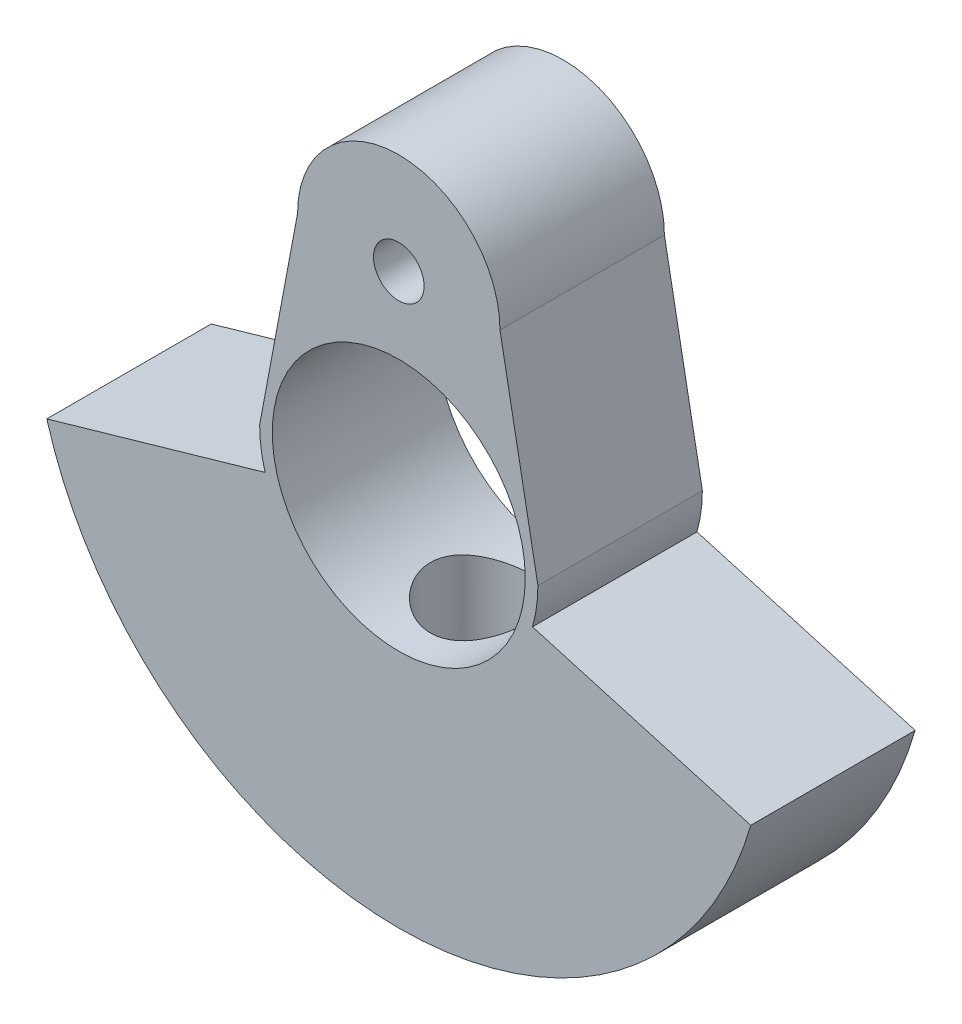
ISO-10303-21;
HEADER;
FILE_DESCRIPTION(('STEP AP214'),'2;1');
FILE_NAME('part.step','',(''),(''),'','','');
FILE_SCHEMA(('AUTOMOTIVE_DESIGN { 1 0 10303 214 1 1 1 1 }'));
ENDSEC;
DATA;
#1=APPLICATION_CONTEXT('core data for automotive mechanical design processes');
#2=APPLICATION_PROTOCOL_DEFINITION('international standard','automotive_design',2000,#1);
#3=PRODUCT_CONTEXT('',#1,'mechanical');
#4=PRODUCT('Part','Part','',(#3));
#5=PRODUCT_RELATED_PRODUCT_CATEGORY('part','',(#4));
#6=PRODUCT_DEFINITION_FORMATION('','',#4);
#7=PRODUCT_DEFINITION_CONTEXT('part definition',#1,'design');
#8=PRODUCT_DEFINITION('design','',#6,#7);
#9=PRODUCT_DEFINITION_SHAPE('','',#8);
#10=(LENGTH_UNIT() NAMED_UNIT(*) SI_UNIT(.MILLI.,.METRE.));
#11=(NAMED_UNIT(*) PLANE_ANGLE_UNIT() SI_UNIT($,.RADIAN.));
#12=(NAMED_UNIT(*) SI_UNIT($,.STERADIAN.) SOLID_ANGLE_UNIT());
#13=UNCERTAINTY_MEASURE_WITH_UNIT(LENGTH_MEASURE(1.E-05),#10,'distance_accuracy_value','');
#14=(GEOMETRIC_REPRESENTATION_CONTEXT(3) GLOBAL_UNCERTAINTY_ASSIGNED_CONTEXT((#13)) GLOBAL_UNIT_ASSIGNED_CONTEXT((#10,
#11,#12)) REPRESENTATION_CONTEXT('',''));
#15=CARTESIAN_POINT('',(0.,0.,0.));
#16=DIRECTION('',(0.,0.,1.));
#17=DIRECTION('',(1.,0.,0.));
#18=AXIS2_PLACEMENT_3D('',#15,#16,#17);
#19=CARTESIAN_POINT('',(0.,0.,6.5));
#20=DIRECTION('',(0.276307273264689,-0.961069347519227,0.));
#21=DIRECTION('',(0.961069347519227,0.276307273264689,0.));
#22=AXIS2_PLACEMENT_3D('',#19,#20,#21);
#23=PLANE('',#22);
#24=DIRECTION('',(-0.961069347519227,-0.276307273264689,0.));
#25=VECTOR('',#24,1.);
#26=CARTESIAN_POINT('',(0.,0.,0.));
#27=LINE('',#26,#25);
#28=CARTESIAN_POINT('',(-5.28588141135575,-1.51969000295579,0.));
#29=VERTEX_POINT('',#28);
#30=CARTESIAN_POINT('',(-13.9130517436444,-4.,0.));
#31=VERTEX_POINT('',#30);
#32=EDGE_CURVE('E271',#29,#31,#27,.T.);
#33=ORIENTED_EDGE('',*,*,#32,.T.);
#34=DIRECTION('',(0.,0.,-1.));
#35=VECTOR('',#34,1.);
#36=CARTESIAN_POINT('',(-13.9130517436444,-4.,6.5));
#37=LINE('',#36,#35);
#38=CARTESIAN_POINT('',(-13.9130517436444,-4.,6.5));
#39=VERTEX_POINT('',#38);
#40=EDGE_CURVE('E288',#39,#31,#37,.T.);
#41=ORIENTED_EDGE('',*,*,#40,.F.);
#42=DIRECTION('',(-0.961069347519227,-0.276307273264689,0.));
#43=VECTOR('',#42,1.);
#44=CARTESIAN_POINT('',(0.,0.,6.5));
#45=LINE('',#44,#43);
#46=CARTESIAN_POINT('',(-5.28588141135575,-1.51969000295579,6.5));
#47=VERTEX_POINT('',#46);
#48=EDGE_CURVE('E297',#47,#39,#45,.T.);
#49=ORIENTED_EDGE('',*,*,#48,.F.);
#50=DIRECTION('',(0.,0.,-1.));
#51=VECTOR('',#50,1.);
#52=CARTESIAN_POINT('',(-5.28588141135575,-1.51969000295579,6.5));
#53=LINE('',#52,#51);
#54=EDGE_CURVE('E176',#47,#29,#53,.T.);
#55=ORIENTED_EDGE('',*,*,#54,.T.);
#56=EDGE_LOOP('',(#33,#41,#49,#55));
#57=FACE_BOUND('',#56,.T.);
#58=ADVANCED_FACE('F162',(#57),#23,.F.);
#59=CARTESIAN_POINT('',(0.,0.,6.5));
#60=DIRECTION('',(0.,0.,-1.));
#61=DIRECTION('',(-1.,0.,0.));
#62=AXIS2_PLACEMENT_3D('',#59,#60,#61);
#63=CYLINDRICAL_SURFACE('',#62,14.4766366543243);
#64=CARTESIAN_POINT('',(0.,-14.4766366543243,5.25));
#65=CARTESIAN_POINT('',(0.11176995730836,-14.4766349668201,5.24999531787187));
#66=CARTESIAN_POINT('',(0.223607249879539,-14.4753286207826,5.24059899533927));
#67=CARTESIAN_POINT('',(0.444162743564742,-14.4702430368634,5.20326754317927));
#68=CARTESIAN_POINT('',(0.552877683008009,-14.4664613046852,5.17531371387353));
#69=CARTESIAN_POINT('',(0.763964109311459,-14.4568504521129,5.10171259079571));
#70=CARTESIAN_POINT('',(0.866340071077471,-14.451022795848,5.05607794756922));
#71=CARTESIAN_POINT('',(1.06196340075863,-14.4379661273012,4.94843995364321));
#72=CARTESIAN_POINT('',(1.15521218053627,-14.4307373322755,4.8864391400912));
#73=CARTESIAN_POINT('',(1.33057367524674,-14.4156299327617,4.74738745243392));
#74=CARTESIAN_POINT('',(1.41261670187738,-14.4077477119569,4.67024907648198));
#75=CARTESIAN_POINT('',(1.56263704508395,-14.3922505595565,4.50330008919239));
#76=CARTESIAN_POINT('',(1.63061359982885,-14.3846356424563,4.41348879194033));
#77=CARTESIAN_POINT('',(1.75083710498361,-14.3705000135134,4.22328244943422));
#78=CARTESIAN_POINT('',(1.80301765195349,-14.3639839705637,4.12284505566044));
#79=CARTESIAN_POINT('',(1.88974372511436,-14.3528325088659,3.91452718689346));
#80=CARTESIAN_POINT('',(1.92429006623307,-14.3481970032147,3.8066470561123));
#81=CARTESIAN_POINT('',(1.97455286721373,-14.3413665871692,3.58723453479968));
#82=CARTESIAN_POINT('',(1.99038788123958,-14.3391563170339,3.47572978922923));
#83=CARTESIAN_POINT('',(2.00314559266907,-14.3373798354986,3.25162542378678));
#84=CARTESIAN_POINT('',(2.00006921393182,-14.3378134949374,3.13902585766725));
#85=CARTESIAN_POINT('',(1.97518856404868,-14.3412618207326,2.91676000553503));
#86=CARTESIAN_POINT('',(1.95351561006842,-14.3442583889815,2.80707869879688));
#87=CARTESIAN_POINT('',(1.89226225338223,-14.3524666494243,2.59292465346332));
#88=CARTESIAN_POINT('',(1.85268141494161,-14.3576783955177,2.48845204167455));
#89=CARTESIAN_POINT('',(1.75659700882936,-14.3697500395445,2.28727727106512));
#90=CARTESIAN_POINT('',(1.70003710521645,-14.3766154089165,2.19060236096327));
#91=CARTESIAN_POINT('',(1.57164030454687,-14.3912166647664,2.00806608391306));
#92=CARTESIAN_POINT('',(1.49980255519563,-14.3989525997986,1.92220532067164));
#93=CARTESIAN_POINT('',(1.34216500524915,-14.4145035598929,1.76297296868527));
#94=CARTESIAN_POINT('',(1.25625215823762,-14.4223187001026,1.6897132590304));
#95=CARTESIAN_POINT('',(1.07329040129023,-14.4370864696785,1.55863616574628));
#96=CARTESIAN_POINT('',(0.976241455017491,-14.4440390962302,1.50081883250729));
#97=CARTESIAN_POINT('',(0.773670696365924,-14.4563042017067,1.40226478478454));
#98=CARTESIAN_POINT('',(0.668145029027119,-14.4616159290177,1.36153589461243));
#99=CARTESIAN_POINT('',(0.451662373390534,-14.4699942347764,1.29840793630832));
#100=CARTESIAN_POINT('',(0.340705696508999,-14.4730609417941,1.2760078184991));
#101=CARTESIAN_POINT('',(0.117477138548468,-14.4765868044994,1.25032016139866));
#102=CARTESIAN_POINT('',(0.00522329352126562,-14.4770669647086,1.24687866003459));
#103=CARTESIAN_POINT('',(-0.218259700937169,-14.4754225789292,1.25879843249488));
#104=CARTESIAN_POINT('',(-0.329488877078452,-14.4732981010305,1.2741592147947));
#105=CARTESIAN_POINT('',(-0.547304770606439,-14.4666961684049,1.32311954284133));
#106=CARTESIAN_POINT('',(-0.653908485701055,-14.462228290871,1.35664487054976));
#107=CARTESIAN_POINT('',(-0.859981331881461,-14.451439288819,1.44090491096956));
#108=CARTESIAN_POINT('',(-0.959450172735718,-14.4451180889648,1.49164032327023));
#109=CARTESIAN_POINT('',(-1.14911199956199,-14.431273675822,1.60924713848316));
#110=CARTESIAN_POINT('',(-1.23924329233125,-14.4237432146389,1.67621716422947));
#111=CARTESIAN_POINT('',(-1.40704191678184,-14.408343249654,1.824253774044));
#112=CARTESIAN_POINT('',(-1.48470863867588,-14.4004737292887,1.90532104736874));
#113=CARTESIAN_POINT('',(-1.62592677009214,-14.3852168666096,2.07993285166112));
#114=CARTESIAN_POINT('',(-1.68937553179233,-14.3778332865112,2.17356077722242));
#115=CARTESIAN_POINT('',(-1.79964534406507,-14.364448610134,2.37023541747579));
#116=CARTESIAN_POINT('',(-1.8464667882954,-14.3584474811264,2.47328190910725));
#117=CARTESIAN_POINT('',(-1.92199024664558,-14.3485336700108,2.68555005409148));
#118=CARTESIAN_POINT('',(-1.95074818577083,-14.3446145478347,2.79475149590668));
#119=CARTESIAN_POINT('',(-1.98950739784898,-14.3392907171116,3.01649169945304));
#120=CARTESIAN_POINT('',(-1.99950975426457,-14.3378858633218,3.12903026802528));
#121=CARTESIAN_POINT('',(-2.00045101215891,-14.3377544812884,3.35322806914543));
#122=CARTESIAN_POINT('',(-1.99155123215409,-14.3390052885226,3.4648866450384));
#123=CARTESIAN_POINT('',(-1.95528451962713,-14.3439953016548,3.68510377678686));
#124=CARTESIAN_POINT('',(-1.92791759988198,-14.347734505831,3.79366233478714));
#125=CARTESIAN_POINT('',(-1.85554728217757,-14.3572725274866,4.00456472113777));
#126=CARTESIAN_POINT('',(-1.81055343691205,-14.3630702292296,4.10691188103978));
#127=CARTESIAN_POINT('',(-1.70422235773258,-14.3760735717928,4.30263024036987));
#128=CARTESIAN_POINT('',(-1.64288474162384,-14.3832792455371,4.39600122982306));
#129=CARTESIAN_POINT('',(-1.50501480907714,-14.3983601067056,4.57193905436356));
#130=CARTESIAN_POINT('',(-1.42836258913612,-14.4062402775265,4.65441151129956));
#131=CARTESIAN_POINT('',(-1.26229188354588,-14.4217394260046,4.80538214851195));
#132=CARTESIAN_POINT('',(-1.17287041567773,-14.4293583421296,4.87387705527148));
#133=CARTESIAN_POINT('',(-0.983316278525677,-14.4435163736081,4.9952265713558));
#134=CARTESIAN_POINT('',(-0.883135820048195,-14.450050312974,5.04800711126817));
#135=CARTESIAN_POINT('',(-0.675293839216323,-14.4612508057841,5.13591702473893));
#136=CARTESIAN_POINT('',(-0.567640393653477,-14.4659193395793,5.17106512742233));
#137=CARTESIAN_POINT('',(-0.382888421394336,-14.4717675254369,5.21451929236027));
#138=CARTESIAN_POINT('',(-0.306943174435611,-14.473584312308,5.22780483216546));
#139=CARTESIAN_POINT('',(-0.154009269756641,-14.4760194523329,5.24554675612826));
#140=CARTESIAN_POINT('',(-0.0770206222267272,-14.4766378171826,5.25000322645217));
#141=CARTESIAN_POINT('',(0.,-14.4766366543243,5.25));
#142=B_SPLINE_CURVE_WITH_KNOTS('',3,(#64,#65,#66,#67,#68,#69,#70,#71,#72,#73,#74,#75,#76,#77,
#78,#79,#80,#81,#82,#83,#84,#85,#86,#87,#88,#89,#90,#91,#92,#93,#94,#95,#96,#97,#98,#99,#100,
#101,#102,#103,#104,#105,#106,#107,#108,#109,#110,#111,#112,#113,#114,#115,#116,#117,#118,#119,
#120,#121,#122,#123,#124,#125,#126,#127,#128,#129,#130,#131,#132,#133,#134,#135,#136,#137,#138,
#139,#140,#141),.UNSPECIFIED.,.T.,.F.,(4,2,2,2,2,2,2,2,2,2,2,2,2,2,2,2,2,2,2,2,2,2,2,2,2,2,2,2,
2,2,2,2,2,2,2,2,2,2,4),(0.,0.33502848577324,0.670395080200199,1.00552216309523,1.34059732376341,
1.67766966945036,2.01476026598262,2.35324885452414,2.69172179911091,3.02803849427898,
3.36433875983881,3.69828364834874,4.03223666284369,4.36731020413251,4.70240244284186,
5.04033137601895,5.37826141188332,5.71634600788101,6.05441124063197,6.38972696823448,
6.72503393028522,7.05898108976871,7.39294182581897,7.72898453312269,8.06504367517959,
8.40345600415696,8.74186032056527,9.07921169768954,9.41654358627553,9.7510081213184,
10.0854724249529,10.4197557199895,10.7540468328394,11.0910657364487,11.428163478918,
11.7668258471033,12.105127723347,12.335997940132,12.5668659037543),.UNSPECIFIED.);
#143=CARTESIAN_POINT('',(0.,-14.4766366543243,5.25));
#144=VERTEX_POINT('',#143);
#145=EDGE_CURVE('E12',#144,#144,#142,.T.);
#146=ORIENTED_EDGE('',*,*,#145,.T.);
#147=EDGE_LOOP('',(#146));
#148=FACE_BOUND('',#147,.T.);
#149=CARTESIAN_POINT('',(0.,0.,0.));
#150=DIRECTION('',(0.,0.,1.));
#151=DIRECTION('',(1.,0.,0.));
#152=AXIS2_PLACEMENT_3D('',#149,#150,#151);
#153=CIRCLE('',#152,14.4766366543243);
#154=CARTESIAN_POINT('',(13.9130517436444,-4.,0.));
#155=VERTEX_POINT('',#154);
#156=EDGE_CURVE('E298',#31,#155,#153,.T.);
#157=ORIENTED_EDGE('',*,*,#156,.T.);
#158=DIRECTION('',(0.,0.,-1.));
#159=VECTOR('',#158,1.);
#160=CARTESIAN_POINT('',(13.9130517436444,-4.,6.5));
#161=LINE('',#160,#159);
#162=CARTESIAN_POINT('',(13.9130517436444,-4.,6.5));
#163=VERTEX_POINT('',#162);
#164=EDGE_CURVE('E291',#163,#155,#161,.T.);
#165=ORIENTED_EDGE('',*,*,#164,.F.);
#166=CARTESIAN_POINT('',(0.,0.,6.5));
#167=DIRECTION('',(0.,0.,1.));
#168=DIRECTION('',(1.,0.,0.));
#169=AXIS2_PLACEMENT_3D('',#166,#167,#168);
#170=CIRCLE('',#169,14.4766366543243);
#171=EDGE_CURVE('E303',#39,#163,#170,.T.);
#172=ORIENTED_EDGE('',*,*,#171,.F.);
#173=ORIENTED_EDGE('',*,*,#40,.T.);
#174=EDGE_LOOP('',(#157,#165,#172,#173));
#175=FACE_BOUND('',#174,.T.);
#176=ADVANCED_FACE('F330',(#148,#175),#63,.T.);
#177=CARTESIAN_POINT('',(0.,0.,6.5));
#178=DIRECTION('',(0.276307273264689,0.961069347519227,0.));
#179=DIRECTION('',(-0.961069347519227,0.276307273264689,0.));
#180=AXIS2_PLACEMENT_3D('',#177,#178,#179);
#181=PLANE('',#180);
#182=DIRECTION('',(0.961069347519227,-0.276307273264689,0.));
#183=VECTOR('',#182,1.);
#184=CARTESIAN_POINT('',(0.,0.,0.));
#185=LINE('',#184,#183);
#186=CARTESIAN_POINT('',(5.28588141135575,-1.51969000295579,0.));
#187=VERTEX_POINT('',#186);
#188=EDGE_CURVE('E295',#187,#155,#185,.T.);
#189=ORIENTED_EDGE('',*,*,#188,.F.);
#190=DIRECTION('',(0.,0.,-1.));
#191=VECTOR('',#190,1.);
#192=CARTESIAN_POINT('',(5.28588141135575,-1.51969000295579,6.5));
#193=LINE('',#192,#191);
#194=CARTESIAN_POINT('',(5.28588141135575,-1.51969000295579,6.5));
#195=VERTEX_POINT('',#194);
#196=EDGE_CURVE('E184',#195,#187,#193,.T.);
#197=ORIENTED_EDGE('',*,*,#196,.F.);
#198=DIRECTION('',(0.961069347519227,-0.276307273264689,0.));
#199=VECTOR('',#198,1.);
#200=CARTESIAN_POINT('',(0.,0.,6.5));
#201=LINE('',#200,#199);
#202=EDGE_CURVE('E294',#195,#163,#201,.T.);
#203=ORIENTED_EDGE('',*,*,#202,.T.);
#204=ORIENTED_EDGE('',*,*,#164,.T.);
#205=EDGE_LOOP('',(#189,#197,#203,#204));
#206=FACE_BOUND('',#205,.T.);
#207=ADVANCED_FACE('F328',(#206),#181,.T.);
#208=CARTESIAN_POINT('',(0.,0.,0.));
#209=DIRECTION('',(0.,0.,1.));
#210=DIRECTION('',(1.,0.,0.));
#211=AXIS2_PLACEMENT_3D('',#208,#209,#210);
#212=PLANE('',#211);
#213=ORIENTED_EDGE('',*,*,#32,.F.);
#214=CARTESIAN_POINT('',(0.,0.,0.));
#215=DIRECTION('',(0.,0.,1.));
#216=DIRECTION('',(1.,0.,0.));
#217=AXIS2_PLACEMENT_3D('',#214,#215,#216);
#218=CIRCLE('',#217,5.5);
#219=CARTESIAN_POINT('',(-5.5,0.,0.));
#220=VERTEX_POINT('',#219);
#221=EDGE_CURVE('E248',#220,#29,#218,.T.);
#222=ORIENTED_EDGE('',*,*,#221,.F.);
#223=DIRECTION('',(-0.184288535050182,-0.982872186934323,0.));
#224=VECTOR('',#223,1.);
#225=CARTESIAN_POINT('',(-5.31320754716982,0.996226415094322,0.));
#226=LINE('',#225,#224);
#227=CARTESIAN_POINT('',(-4.00000000000003,8.,0.));
#228=VERTEX_POINT('',#227);
#229=EDGE_CURVE('E225',#228,#220,#226,.T.);
#230=ORIENTED_EDGE('',*,*,#229,.F.);
#231=CARTESIAN_POINT('',(0.,8.,0.));
#232=DIRECTION('',(0.,0.,1.));
#233=DIRECTION('',(1.,0.,0.));
#234=AXIS2_PLACEMENT_3D('',#231,#232,#233);
#235=CIRCLE('',#234,4.00000000000002);
#236=CARTESIAN_POINT('',(4.00000000000001,8.,0.));
#237=VERTEX_POINT('',#236);
#238=EDGE_CURVE('E240',#237,#228,#235,.T.);
#239=ORIENTED_EDGE('',*,*,#238,.F.);
#240=DIRECTION('',(0.184288535050185,-0.982872186934322,0.));
#241=VECTOR('',#240,1.);
#242=CARTESIAN_POINT('',(5.31320754716982,0.996226415094341,0.));
#243=LINE('',#242,#241);
#244=CARTESIAN_POINT('',(5.50000000000001,0.,0.));
#245=VERTEX_POINT('',#244);
#246=EDGE_CURVE('E232',#237,#245,#243,.T.);
#247=ORIENTED_EDGE('',*,*,#246,.T.);
#248=EDGE_CURVE('E238',#187,#245,#218,.T.);
#249=ORIENTED_EDGE('',*,*,#248,.F.);
#250=ORIENTED_EDGE('',*,*,#188,.T.);
#251=ORIENTED_EDGE('',*,*,#156,.F.);
#252=EDGE_LOOP('',(#213,#222,#230,#239,#247,#249,#250,#251));
#253=FACE_BOUND('',#252,.T.);
#254=CARTESIAN_POINT('',(0.,0.,0.));
#255=DIRECTION('',(0.,0.,1.));
#256=DIRECTION('',(1.,0.,0.));
#257=AXIS2_PLACEMENT_3D('',#254,#255,#256);
#258=CIRCLE('',#257,5.);
#259=CARTESIAN_POINT('',(5.,0.,0.));
#260=VERTEX_POINT('',#259);
#261=EDGE_CURVE('E263',#260,#260,#258,.T.);
#262=ORIENTED_EDGE('',*,*,#261,.T.);
#263=EDGE_LOOP('',(#262));
#264=FACE_BOUND('',#263,.T.);
#265=CARTESIAN_POINT('',(0.,8.,0.));
#266=DIRECTION('',(0.,0.,1.));
#267=DIRECTION('',(1.,0.,0.));
#268=AXIS2_PLACEMENT_3D('',#265,#266,#267);
#269=CIRCLE('',#268,1.);
#270=CARTESIAN_POINT('',(-1.,8.,0.));
#271=VERTEX_POINT('',#270);
#272=EDGE_CURVE('E243',#271,#271,#269,.T.);
#273=ORIENTED_EDGE('',*,*,#272,.T.);
#274=EDGE_LOOP('',(#273));
#275=FACE_BOUND('',#274,.T.);
#276=ADVANCED_FACE('F235',(#253,#264,#275),#212,.F.);
#277=CARTESIAN_POINT('',(0.,0.,6.5));
#278=DIRECTION('',(0.,0.,1.));
#279=DIRECTION('',(1.,0.,0.));
#280=AXIS2_PLACEMENT_3D('',#277,#278,#279);
#281=PLANE('',#280);
#282=ORIENTED_EDGE('',*,*,#202,.F.);
#283=CARTESIAN_POINT('',(0.,0.,6.5));
#284=DIRECTION('',(0.,0.,1.));
#285=DIRECTION('',(1.,0.,0.));
#286=AXIS2_PLACEMENT_3D('',#283,#284,#285);
#287=CIRCLE('',#286,5.5);
#288=CARTESIAN_POINT('',(5.50000000000001,0.,6.5));
#289=VERTEX_POINT('',#288);
#290=EDGE_CURVE('E259',#195,#289,#287,.T.);
#291=ORIENTED_EDGE('',*,*,#290,.T.);
#292=DIRECTION('',(0.184288535050185,-0.982872186934322,0.));
#293=VECTOR('',#292,1.);
#294=CARTESIAN_POINT('',(5.31320754716982,0.996226415094341,6.5));
#295=LINE('',#294,#293);
#296=CARTESIAN_POINT('',(4.00000000000001,8.,6.5));
#297=VERTEX_POINT('',#296);
#298=EDGE_CURVE('E253',#297,#289,#295,.T.);
#299=ORIENTED_EDGE('',*,*,#298,.F.);
#300=CARTESIAN_POINT('',(0.,8.,6.5));
#301=DIRECTION('',(0.,0.,1.));
#302=DIRECTION('',(1.,0.,0.));
#303=AXIS2_PLACEMENT_3D('',#300,#301,#302);
#304=CIRCLE('',#303,4.00000000000002);
#305=CARTESIAN_POINT('',(-4.00000000000003,8.,6.5));
#306=VERTEX_POINT('',#305);
#307=EDGE_CURVE('E281',#297,#306,#304,.T.);
#308=ORIENTED_EDGE('',*,*,#307,.T.);
#309=DIRECTION('',(-0.184288535050182,-0.982872186934323,0.));
#310=VECTOR('',#309,1.);
#311=CARTESIAN_POINT('',(-5.31320754716982,0.996226415094322,6.5));
#312=LINE('',#311,#310);
#313=CARTESIAN_POINT('',(-5.5,0.,6.5));
#314=VERTEX_POINT('',#313);
#315=EDGE_CURVE('E274',#306,#314,#312,.T.);
#316=ORIENTED_EDGE('',*,*,#315,.T.);
#317=EDGE_CURVE('E256',#314,#47,#287,.T.);
#318=ORIENTED_EDGE('',*,*,#317,.T.);
#319=ORIENTED_EDGE('',*,*,#48,.T.);
#320=ORIENTED_EDGE('',*,*,#171,.T.);
#321=EDGE_LOOP('',(#282,#291,#299,#308,#316,#318,#319,#320));
#322=FACE_BOUND('',#321,.T.);
#323=CARTESIAN_POINT('',(0.,0.,6.5));
#324=DIRECTION('',(0.,0.,1.));
#325=DIRECTION('',(1.,0.,0.));
#326=AXIS2_PLACEMENT_3D('',#323,#324,#325);
#327=CIRCLE('',#326,5.);
#328=CARTESIAN_POINT('',(5.,0.,6.5));
#329=VERTEX_POINT('',#328);
#330=EDGE_CURVE('E249',#329,#329,#327,.T.);
#331=ORIENTED_EDGE('',*,*,#330,.F.);
#332=EDGE_LOOP('',(#331));
#333=FACE_BOUND('',#332,.T.);
#334=CARTESIAN_POINT('',(0.,8.,6.5));
#335=DIRECTION('',(0.,0.,1.));
#336=DIRECTION('',(1.,0.,0.));
#337=AXIS2_PLACEMENT_3D('',#334,#335,#336);
#338=CIRCLE('',#337,1.);
#339=CARTESIAN_POINT('',(-1.,8.,6.5));
#340=VERTEX_POINT('',#339);
#341=EDGE_CURVE('E276',#340,#340,#338,.T.);
#342=ORIENTED_EDGE('',*,*,#341,.F.);
#343=EDGE_LOOP('',(#342));
#344=FACE_BOUND('',#343,.T.);
#345=ADVANCED_FACE('F319',(#322,#333,#344),#281,.T.);
#346=CARTESIAN_POINT('',(0.,8.,6.5));
#347=DIRECTION('',(0.,0.,-1.));
#348=DIRECTION('',(-1.,0.,0.));
#349=AXIS2_PLACEMENT_3D('',#346,#347,#348);
#350=CYLINDRICAL_SURFACE('',#349,4.00000000000002);
#351=ORIENTED_EDGE('',*,*,#238,.T.);
#352=DIRECTION('',(0.,0.,-1.));
#353=VECTOR('',#352,1.);
#354=CARTESIAN_POINT('',(-4.00000000000003,8.,6.5));
#355=LINE('',#354,#353);
#356=EDGE_CURVE('E272',#306,#228,#355,.T.);
#357=ORIENTED_EDGE('',*,*,#356,.F.);
#358=ORIENTED_EDGE('',*,*,#307,.F.);
#359=DIRECTION('',(0.,0.,-1.));
#360=VECTOR('',#359,1.);
#361=CARTESIAN_POINT('',(4.00000000000001,8.,6.5));
#362=LINE('',#361,#360);
#363=EDGE_CURVE('E269',#297,#237,#362,.T.);
#364=ORIENTED_EDGE('',*,*,#363,.T.);
#365=EDGE_LOOP('',(#351,#357,#358,#364));
#366=FACE_BOUND('',#365,.T.);
#367=ADVANCED_FACE('F323',(#366),#350,.T.);
#368=CARTESIAN_POINT('',(-5.31320754716982,0.996226415094322,6.5));
#369=DIRECTION('',(0.982872186934323,-0.184288535050182,0.));
#370=DIRECTION('',(0.184288535050182,0.982872186934323,0.));
#371=AXIS2_PLACEMENT_3D('',#368,#369,#370);
#372=PLANE('',#371);
#373=ORIENTED_EDGE('',*,*,#229,.T.);
#374=DIRECTION('',(0.,0.,-1.));
#375=VECTOR('',#374,1.);
#376=CARTESIAN_POINT('',(-5.5,0.,6.5));
#377=LINE('',#376,#375);
#378=EDGE_CURVE('E255',#314,#220,#377,.T.);
#379=ORIENTED_EDGE('',*,*,#378,.F.);
#380=ORIENTED_EDGE('',*,*,#315,.F.);
#381=ORIENTED_EDGE('',*,*,#356,.T.);
#382=EDGE_LOOP('',(#373,#379,#380,#381));
#383=FACE_BOUND('',#382,.T.);
#384=ADVANCED_FACE('F338',(#383),#372,.F.);
#385=CARTESIAN_POINT('',(5.31320754716982,0.996226415094341,6.5));
#386=DIRECTION('',(0.982872186934322,0.184288535050185,0.));
#387=DIRECTION('',(-0.184288535050185,0.982872186934322,0.));
#388=AXIS2_PLACEMENT_3D('',#385,#386,#387);
#389=PLANE('',#388);
#390=ORIENTED_EDGE('',*,*,#246,.F.);
#391=ORIENTED_EDGE('',*,*,#363,.F.);
#392=ORIENTED_EDGE('',*,*,#298,.T.);
#393=DIRECTION('',(0.,0.,-1.));
#394=VECTOR('',#393,1.);
#395=CARTESIAN_POINT('',(5.50000000000001,0.,6.5));
#396=LINE('',#395,#394);
#397=EDGE_CURVE('E247',#289,#245,#396,.T.);
#398=ORIENTED_EDGE('',*,*,#397,.T.);
#399=EDGE_LOOP('',(#390,#391,#392,#398));
#400=FACE_BOUND('',#399,.T.);
#401=ADVANCED_FACE('F251',(#400),#389,.T.);
#402=CARTESIAN_POINT('',(0.,8.,6.5));
#403=DIRECTION('',(0.,0.,-1.));
#404=DIRECTION('',(-1.,0.,0.));
#405=AXIS2_PLACEMENT_3D('',#402,#403,#404);
#406=CYLINDRICAL_SURFACE('',#405,1.);
#407=CARTESIAN_POINT('',(-1.,8.,6.5));
#408=CARTESIAN_POINT('',(-1.,8.,6.43229166666667));
#409=CARTESIAN_POINT('',(-1.,8.,6.36458333333333));
#410=CARTESIAN_POINT('',(-1.,8.,6.22916666666667));
#411=CARTESIAN_POINT('',(-1.,8.,6.16145833333333));
#412=CARTESIAN_POINT('',(-1.,8.,6.02604166666667));
#413=CARTESIAN_POINT('',(-1.,8.,5.95833333333333));
#414=CARTESIAN_POINT('',(-1.,8.,5.82291666666667));
#415=CARTESIAN_POINT('',(-1.,8.,5.75520833333333));
#416=CARTESIAN_POINT('',(-1.,8.,5.61979166666667));
#417=CARTESIAN_POINT('',(-1.,8.,5.55208333333333));
#418=CARTESIAN_POINT('',(-1.,8.,5.41666666666667));
#419=CARTESIAN_POINT('',(-1.,8.,5.34895833333333));
#420=CARTESIAN_POINT('',(-1.,8.,5.21354166666667));
#421=CARTESIAN_POINT('',(-1.,8.,5.14583333333333));
#422=CARTESIAN_POINT('',(-1.,8.,5.01041666666667));
#423=CARTESIAN_POINT('',(-1.,8.,4.94270833333333));
#424=CARTESIAN_POINT('',(-1.,8.,4.80729166666667));
#425=CARTESIAN_POINT('',(-1.,8.,4.73958333333333));
#426=CARTESIAN_POINT('',(-1.,8.,4.60416666666667));
#427=CARTESIAN_POINT('',(-1.,8.,4.53645833333333));
#428=CARTESIAN_POINT('',(-1.,8.,4.40104166666667));
#429=CARTESIAN_POINT('',(-1.,8.,4.33333333333333));
#430=CARTESIAN_POINT('',(-1.,8.,4.19791666666667));
#431=CARTESIAN_POINT('',(-1.,8.,4.13020833333333));
#432=CARTESIAN_POINT('',(-1.,8.,3.99479166666667));
#433=CARTESIAN_POINT('',(-1.,8.,3.92708333333333));
#434=CARTESIAN_POINT('',(-1.,8.,3.79166666666667));
#435=CARTESIAN_POINT('',(-1.,8.,3.72395833333333));
#436=CARTESIAN_POINT('',(-1.,8.,3.58854166666667));
#437=CARTESIAN_POINT('',(-1.,8.,3.52083333333333));
#438=CARTESIAN_POINT('',(-1.,8.,3.38541666666667));
#439=CARTESIAN_POINT('',(-1.,8.,3.31770833333333));
#440=CARTESIAN_POINT('',(-1.,8.,3.18229166666667));
#441=CARTESIAN_POINT('',(-1.,8.,3.11458333333333));
#442=CARTESIAN_POINT('',(-1.,8.,2.97916666666667));
#443=CARTESIAN_POINT('',(-1.,8.,2.91145833333333));
#444=CARTESIAN_POINT('',(-1.,8.,2.77604166666667));
#445=CARTESIAN_POINT('',(-1.,8.,2.70833333333333));
#446=CARTESIAN_POINT('',(-1.,8.,2.57291666666667));
#447=CARTESIAN_POINT('',(-1.,8.,2.50520833333333));
#448=CARTESIAN_POINT('',(-1.,8.,2.36979166666667));
#449=CARTESIAN_POINT('',(-1.,8.,2.30208333333333));
#450=CARTESIAN_POINT('',(-1.,8.,2.16666666666667));
#451=CARTESIAN_POINT('',(-1.,8.,2.09895833333333));
#452=CARTESIAN_POINT('',(-1.,8.,1.96354166666667));
#453=CARTESIAN_POINT('',(-1.,8.,1.89583333333333));
#454=CARTESIAN_POINT('',(-1.,8.,1.76041666666667));
#455=CARTESIAN_POINT('',(-1.,8.,1.69270833333333));
#456=CARTESIAN_POINT('',(-1.,8.,1.55729166666667));
#457=CARTESIAN_POINT('',(-1.,8.,1.48958333333333));
#458=CARTESIAN_POINT('',(-1.,8.,1.35416666666667));
#459=CARTESIAN_POINT('',(-1.,8.,1.28645833333333));
#460=CARTESIAN_POINT('',(-1.,8.,1.15104166666667));
#461=CARTESIAN_POINT('',(-1.,8.,1.08333333333333));
#462=CARTESIAN_POINT('',(-1.,8.,0.947916666666667));
#463=CARTESIAN_POINT('',(-1.,8.,0.880208333333333));
#464=CARTESIAN_POINT('',(-1.,8.,0.744791666666667));
#465=CARTESIAN_POINT('',(-1.,8.,0.677083333333333));
#466=CARTESIAN_POINT('',(-1.,8.,0.541666666666667));
#467=CARTESIAN_POINT('',(-1.,8.,0.473958333333333));
#468=CARTESIAN_POINT('',(-1.,8.,0.338541666666667));
#469=CARTESIAN_POINT('',(-1.,8.,0.270833333333334));
#470=CARTESIAN_POINT('',(-1.,8.,0.135416666666667));
#471=CARTESIAN_POINT('',(-1.,8.,0.0677083333333334));
#472=CARTESIAN_POINT('',(-1.,8.,0.));
#473=B_SPLINE_CURVE_WITH_KNOTS('',3,(#407,#408,#409,#410,#411,#412,#413,#414,#415,#416,#417,
#418,#419,#420,#421,#422,#423,#424,#425,#426,#427,#428,#429,#430,#431,#432,#433,#434,#435,#436,
#437,#438,#439,#440,#441,#442,#443,#444,#445,#446,#447,#448,#449,#450,#451,#452,#453,#454,#455,
#456,#457,#458,#459,#460,#461,#462,#463,#464,#465,#466,#467,#468,#469,#470,#471,#472),
.UNSPECIFIED.,.F.,.F.,(4,2,2,2,2,2,2,2,2,2,2,2,2,2,2,2,2,2,2,2,2,2,2,2,2,2,2,2,2,2,2,2,4),(0.,
0.203125,0.40625,0.609375000000001,0.812500000000001,1.015625,1.21875,1.421875,1.625,1.828125,
2.03125,2.234375,2.4375,2.640625,2.84375,3.046875,3.25,3.453125,3.65625,3.859375,4.0625,
4.265625,4.46875,4.671875,4.875,5.078125,5.28125,5.484375,5.6875,5.890625,6.09375,6.296875,6.5),.UNSPECIFIED.);
#474=EDGE_CURVE('BSEAM345',#340,#271,#473,.T.);
#475=ORIENTED_EDGE('',*,*,#341,.T.);
#476=ORIENTED_EDGE('',*,*,#272,.F.);
#477=ORIENTED_EDGE('',*,*,#474,.T.);
#478=ORIENTED_EDGE('',*,*,#474,.F.);
#479=EDGE_LOOP('',(#475,#477,#476,#478));
#480=FACE_BOUND('',#479,.T.);
#481=ADVANCED_FACE('F345',(#480),#406,.F.);
#482=CARTESIAN_POINT('',(0.,0.,6.5));
#483=DIRECTION('',(0.,0.,-1.));
#484=DIRECTION('',(-1.,0.,0.));
#485=AXIS2_PLACEMENT_3D('',#482,#483,#484);
#486=CYLINDRICAL_SURFACE('',#485,5.5);
#487=ORIENTED_EDGE('',*,*,#221,.T.);
#488=ORIENTED_EDGE('',*,*,#54,.F.);
#489=ORIENTED_EDGE('',*,*,#317,.F.);
#490=ORIENTED_EDGE('',*,*,#378,.T.);
#491=EDGE_LOOP('',(#487,#488,#489,#490));
#492=FACE_BOUND('',#491,.T.);
#493=ADVANCED_FACE('F325',(#492),#486,.T.);
#494=ORIENTED_EDGE('',*,*,#196,.T.);
#495=ORIENTED_EDGE('',*,*,#248,.T.);
#496=ORIENTED_EDGE('',*,*,#397,.F.);
#497=ORIENTED_EDGE('',*,*,#290,.F.);
#498=EDGE_LOOP('',(#494,#495,#496,#497));
#499=FACE_BOUND('',#498,.T.);
#500=ADVANCED_FACE('F164',(#499),#486,.T.);
#501=CARTESIAN_POINT('',(0.,0.,6.5));
#502=DIRECTION('',(0.,0.,-1.));
#503=DIRECTION('',(-1.,0.,0.));
#504=AXIS2_PLACEMENT_3D('',#501,#502,#503);
#505=CYLINDRICAL_SURFACE('',#504,5.);
#506=CARTESIAN_POINT('',(0.,-5.,5.25));
#507=CARTESIAN_POINT('',(0.107493005442891,-4.99999271227085,5.24999014817627));
#508=CARTESIAN_POINT('',(0.215172564090673,-4.99649294306933,5.24128224791162));
#509=CARTESIAN_POINT('',(0.427496480417895,-4.98283453100642,5.20675229647876));
#510=CARTESIAN_POINT('',(0.532131777561247,-4.97265778698877,5.18088372091387));
#511=CARTESIAN_POINT('',(0.734953922727402,-4.94674209213118,5.11312392194117));
#512=CARTESIAN_POINT('',(0.833160661616957,-4.93102136364072,5.07128515378327));
#513=CARTESIAN_POINT('',(1.02107197032837,-4.89556610796078,4.97298082667345));
#514=CARTESIAN_POINT('',(1.11077947675099,-4.87583297458057,4.91652034508107));
#515=CARTESIAN_POINT('',(1.28350100757039,-4.83330886170419,4.78776450143906));
#516=CARTESIAN_POINT('',(1.36606227255021,-4.81042296929191,4.71489334375973));
#517=CARTESIAN_POINT('',(1.51817500478472,-4.76460576906195,4.55659999652322));
#518=CARTESIAN_POINT('',(1.58772010713353,-4.74167444453792,4.47117170278826));
#519=CARTESIAN_POINT('',(1.71487456729288,-4.69722791797136,4.28557192975773));
#520=CARTESIAN_POINT('',(1.77181498119547,-4.67582115964951,4.1849135139768));
#521=CARTESIAN_POINT('',(1.86775471903715,-4.63833647186793,3.97446360157996));
#522=CARTESIAN_POINT('',(1.90676256428583,-4.62225601244176,3.86467647215164));
#523=CARTESIAN_POINT('',(1.96389882339587,-4.59826357660819,3.6442876664079));
#524=CARTESIAN_POINT('',(1.98289396580565,-4.59001420355605,3.53394876442379));
#525=CARTESIAN_POINT('',(2.00217296164003,-4.58164004049144,3.31136500169273));
#526=CARTESIAN_POINT('',(2.00246601631322,-4.58151125522768,3.19912110537499));
#527=CARTESIAN_POINT('',(1.98498936750454,-4.58910500279994,2.98424332854196));
#528=CARTESIAN_POINT('',(1.96847531430513,-4.5962817503845,2.88148428559097));
#529=CARTESIAN_POINT('',(1.91994688029782,-4.61676187607836,2.68034044399329));
#530=CARTESIAN_POINT('',(1.88792979480463,-4.63006632321673,2.58195641188969));
#531=CARTESIAN_POINT('',(1.80869473255107,-4.6615948508853,2.38998216380396));
#532=CARTESIAN_POINT('',(1.76117986231532,-4.67991379280788,2.29653076094531));
#533=CARTESIAN_POINT('',(1.65250646073221,-4.7193811638989,2.11858418363844));
#534=CARTESIAN_POINT('',(1.59134280510084,-4.74053065456848,2.0340923905972));
#535=CARTESIAN_POINT('',(1.45155059945443,-4.78526736742271,1.869590271198));
#536=CARTESIAN_POINT('',(1.37193746297063,-4.80891664976152,1.79043127055399));
#537=CARTESIAN_POINT('',(1.20031442743019,-4.85459824958282,1.64631552199796));
#538=CARTESIAN_POINT('',(1.10830206533443,-4.87663024445325,1.58136160258971));
#539=CARTESIAN_POINT('',(0.912077652605843,-4.91714681264548,1.46638255258417));
#540=CARTESIAN_POINT('',(0.807660491346477,-4.93555270095415,1.41667771880295));
#541=CARTESIAN_POINT('',(0.591023765482883,-4.96614828328759,1.33583213892195));
#542=CARTESIAN_POINT('',(0.478808196849675,-4.97834113462382,1.30468196244259));
#543=CARTESIAN_POINT('',(0.256895887607821,-4.99456139506911,1.2635517045803));
#544=CARTESIAN_POINT('',(0.147443293985536,-4.99902945833514,1.25242754574644));
#545=CARTESIAN_POINT('',(-0.0718453098078161,-5.00068478510631,1.24828689947139));
#546=CARTESIAN_POINT('',(-0.181681213223923,-4.99787393582292,1.25526571845249));
#547=CARTESIAN_POINT('',(-0.393432739121987,-4.98557567063753,1.28629175255199));
#548=CARTESIAN_POINT('',(-0.495482491775473,-4.97639391345523,1.30955798035098));
#549=CARTESIAN_POINT('',(-0.694135428060779,-4.952594414055,1.37143570830981));
#550=CARTESIAN_POINT('',(-0.790737910224843,-4.9379759735653,1.41004917966868));
#551=CARTESIAN_POINT('',(-0.979078785816701,-4.90416594770812,1.50278493967995));
#552=CARTESIAN_POINT('',(-1.0705780227554,-4.88484815979804,1.55734547204315));
#553=CARTESIAN_POINT('',(-1.24344359124655,-4.84373364745525,1.67994032390565));
#554=CARTESIAN_POINT('',(-1.32480584076112,-4.82193593110271,1.74798004292262));
#555=CARTESIAN_POINT('',(-1.48072304302882,-4.77645117638112,1.90087001294963));
#556=CARTESIAN_POINT('',(-1.55447393380606,-4.75273441425052,1.98653354150621));
#557=CARTESIAN_POINT('',(-1.68675119741371,-4.70741672917132,2.16944008300937));
#558=CARTESIAN_POINT('',(-1.74527506133751,-4.68581615526511,2.26668500033995));
#559=CARTESIAN_POINT('',(-1.84580750193163,-4.64714299907709,2.4714616945941));
#560=CARTESIAN_POINT('',(-1.88765059453445,-4.63011630884788,2.57908399921231));
#561=CARTESIAN_POINT('',(-1.9522962197053,-4.60323673477932,2.80073365171515));
#562=CARTESIAN_POINT('',(-1.97511280526931,-4.59337855695998,2.91475620581243));
#563=CARTESIAN_POINT('',(-1.9997156172784,-4.58271759299926,3.13712790177454));
#564=CARTESIAN_POINT('',(-2.00289708230287,-4.58131421008171,3.24529483959335));
#565=CARTESIAN_POINT('',(-1.99180315927752,-4.58614836033098,3.46054485771329));
#566=CARTESIAN_POINT('',(-1.97752998791378,-4.59238492324793,3.56762807390258));
#567=CARTESIAN_POINT('',(-1.93307136615365,-4.61126649079021,3.77333218985504));
#568=CARTESIAN_POINT('',(-1.90353749357098,-4.62364831827449,3.872120274433));
#569=CARTESIAN_POINT('',(-1.83000544849101,-4.65324001232697,4.06337862961348));
#570=CARTESIAN_POINT('',(-1.78600328139381,-4.67045121206007,4.15584714689982));
#571=CARTESIAN_POINT('',(-1.68187276275973,-4.70898609604491,4.33760961927078));
#572=CARTESIAN_POINT('',(-1.62096533515949,-4.73048882313242,4.42641867013048));
#573=CARTESIAN_POINT('',(-1.48589211927149,-4.77463804372237,4.59299331720375));
#574=CARTESIAN_POINT('',(-1.41172233481812,-4.79728488048406,4.67075557212831));
#575=CARTESIAN_POINT('',(-1.24650550627246,-4.84293567087394,4.81820285326361));
#576=CARTESIAN_POINT('',(-1.15467600114614,-4.86586757962185,4.88703730689807));
#577=CARTESIAN_POINT('',(-0.959900320285778,-4.90800406713717,5.00833704262163));
#578=CARTESIAN_POINT('',(-0.856949004547236,-4.92720691092906,5.06079471215253));
#579=CARTESIAN_POINT('',(-0.644738062495202,-4.95939714815861,5.14662221519029));
#580=CARTESIAN_POINT('',(-0.535631618219695,-4.97249363055028,5.18032932356033));
#581=CARTESIAN_POINT('',(-0.312876546281221,-4.99144306209366,5.22863912095426));
#582=CARTESIAN_POINT('',(-0.199243525858913,-4.99731899495638,5.2433024367439));
#583=CARTESIAN_POINT('',(-0.0569122978909298,-4.99975899504136,5.24939538097827));
#584=CARTESIAN_POINT('',(-0.0284626887407584,-5.00000192969176,5.25000260862919));
#585=CARTESIAN_POINT('',(0.,-5.,5.25));
#586=B_SPLINE_CURVE_WITH_KNOTS('',3,(#506,#507,#508,#509,#510,#511,#512,#513,#514,#515,#516,
#517,#518,#519,#520,#521,#522,#523,#524,#525,#526,#527,#528,#529,#530,#531,#532,#533,#534,#535,
#536,#537,#538,#539,#540,#541,#542,#543,#544,#545,#546,#547,#548,#549,#550,#551,#552,#553,#554,
#555,#556,#557,#558,#559,#560,#561,#562,#563,#564,#565,#566,#567,#568,#569,#570,#571,#572,#573,
#574,#575,#576,#577,#578,#579,#580,#581,#582,#583,#584,#585),.UNSPECIFIED.,.T.,.F.,(4,2,2,2,2,2,
2,2,2,2,2,2,2,2,2,2,2,2,2,2,2,2,2,2,2,2,2,2,2,2,2,2,2,2,2,2,2,2,2,4),(0.,0.322402987893071,
0.645683636007934,0.967911457471579,1.29002753567984,1.62597381700397,1.96208394934411,
2.31315258819217,2.66405423118268,2.99904105308828,3.33386306340488,3.64538328401372,
3.95695787256047,4.27489126298815,4.59294421938183,4.93558349186556,5.27829092839732,
5.62776913162806,5.9770695611379,6.30569184528007,6.63422893570081,6.94800455564365,
7.26182048993796,7.58523513398262,7.90877959498968,8.25368474624413,8.59864669043747,
8.94695045140827,9.29499672645933,9.61799673392747,9.94095572563045,10.2511431854877,
10.5614163580516,10.8894546805669,11.2175920134839,11.5670042353384,11.9165786364053,
12.2596430101332,12.6016125240434,12.6869804589679),.UNSPECIFIED.);
#587=CARTESIAN_POINT('',(0.,-5.,5.25));
#588=VERTEX_POINT('',#587);
#589=EDGE_CURVE('E266',#588,#588,#586,.T.);
#590=ORIENTED_EDGE('',*,*,#589,.F.);
#591=EDGE_LOOP('',(#590));
#592=FACE_BOUND('',#591,.T.);
#593=ORIENTED_EDGE('',*,*,#330,.T.);
#594=EDGE_LOOP('',(#593));
#595=FACE_BOUND('',#594,.T.);
#596=ORIENTED_EDGE('',*,*,#261,.F.);
#597=EDGE_LOOP('',(#596));
#598=FACE_BOUND('',#597,.T.);
#599=ADVANCED_FACE('F311',(#592,#595,#598),#505,.F.);
#600=CARTESIAN_POINT('',(0.,0.,3.25));
#601=DIRECTION('',(0.,1.,0.));
#602=DIRECTION('',(0.,0.,1.));
#603=AXIS2_PLACEMENT_3D('',#600,#601,#602);
#604=CYLINDRICAL_SURFACE('',#603,2.);
#605=ORIENTED_EDGE('',*,*,#589,.T.);
#606=EDGE_LOOP('',(#605));
#607=FACE_BOUND('',#606,.T.);
#608=ORIENTED_EDGE('',*,*,#145,.F.);
#609=EDGE_LOOP('',(#608));
#610=FACE_BOUND('',#609,.T.);
#611=ADVANCED_FACE('F314',(#607,#610),#604,.F.);
#612=CLOSED_SHELL('',(#58,#176,#207,#276,#345,#367,#384,#401,#481,#493,#500,#599,#611));
#613=MANIFOLD_SOLID_BREP('B2',#612);
#614=ADVANCED_BREP_SHAPE_REPRESENTATION('',(#18,#613),#14);
#615=SHAPE_DEFINITION_REPRESENTATION(#9,#614);
ENDSEC;
END-ISO-10303-21;
